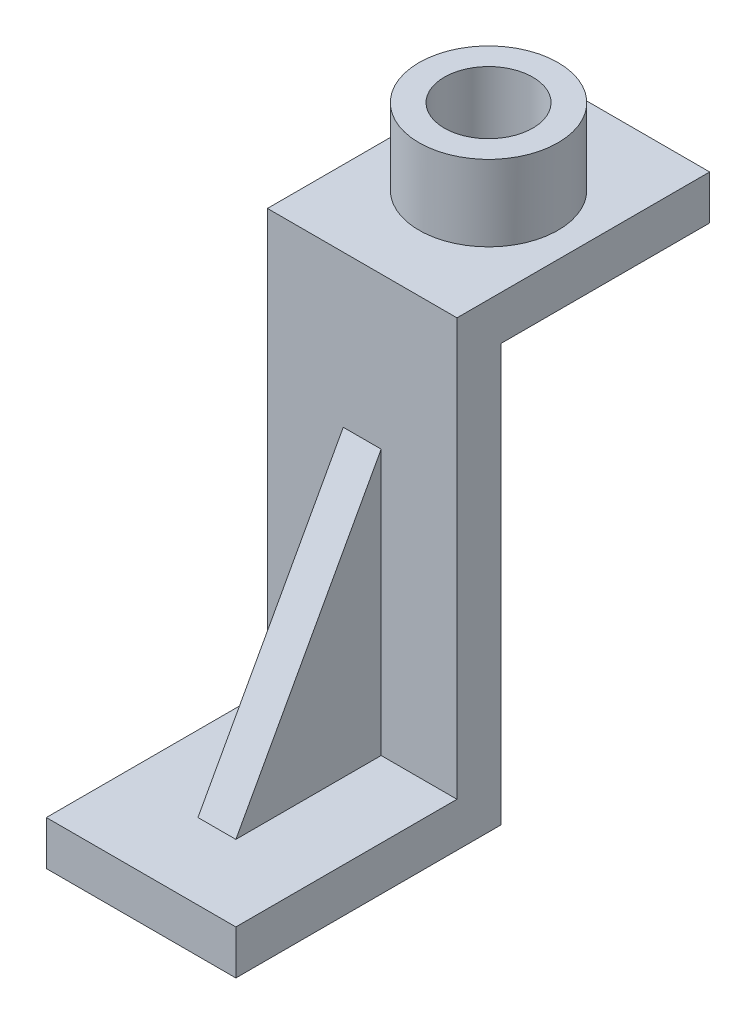
ISO-10303-21;
HEADER;
FILE_DESCRIPTION(('STEP AP214'),'2;1');
FILE_NAME('part.step','',(''),(''),'','','');
FILE_SCHEMA(('AUTOMOTIVE_DESIGN { 1 0 10303 214 1 1 1 1 }'));
ENDSEC;
DATA;
#1=APPLICATION_CONTEXT('core data for automotive mechanical design processes');
#2=APPLICATION_PROTOCOL_DEFINITION('international standard','automotive_design',2000,#1);
#3=PRODUCT_CONTEXT('',#1,'mechanical');
#4=PRODUCT('Part','Part','',(#3));
#5=PRODUCT_RELATED_PRODUCT_CATEGORY('part','',(#4));
#6=PRODUCT_DEFINITION_FORMATION('','',#4);
#7=PRODUCT_DEFINITION_CONTEXT('part definition',#1,'design');
#8=PRODUCT_DEFINITION('design','',#6,#7);
#9=PRODUCT_DEFINITION_SHAPE('','',#8);
#10=(LENGTH_UNIT() NAMED_UNIT(*) SI_UNIT(.MILLI.,.METRE.));
#11=(NAMED_UNIT(*) PLANE_ANGLE_UNIT() SI_UNIT($,.RADIAN.));
#12=(NAMED_UNIT(*) SI_UNIT($,.STERADIAN.) SOLID_ANGLE_UNIT());
#13=UNCERTAINTY_MEASURE_WITH_UNIT(LENGTH_MEASURE(1.E-05),#10,'distance_accuracy_value','');
#14=(GEOMETRIC_REPRESENTATION_CONTEXT(3) GLOBAL_UNCERTAINTY_ASSIGNED_CONTEXT((#13)) GLOBAL_UNIT_ASSIGNED_CONTEXT((#10,
#11,#12)) REPRESENTATION_CONTEXT('',''));
#15=CARTESIAN_POINT('',(0.,0.,0.));
#16=DIRECTION('',(0.,0.,1.));
#17=DIRECTION('',(1.,0.,0.));
#18=AXIS2_PLACEMENT_3D('',#15,#16,#17);
#19=CARTESIAN_POINT('',(0.,7.,-21.));
#20=DIRECTION('',(0.,-1.,0.));
#21=DIRECTION('',(0.,0.,-1.));
#22=AXIS2_PLACEMENT_3D('',#19,#20,#21);
#23=PLANE('',#22);
#24=DIRECTION('',(0.,0.,-1.));
#25=VECTOR('',#24,1.);
#26=CARTESIAN_POINT('',(18.,7.,9.));
#27=LINE('',#26,#25);
#28=CARTESIAN_POINT('',(18.,7.,9.));
#29=VERTEX_POINT('',#28);
#30=CARTESIAN_POINT('',(18.,7.,-14.));
#31=VERTEX_POINT('',#30);
#32=EDGE_CURVE('E126',#29,#31,#27,.T.);
#33=ORIENTED_EDGE('',*,*,#32,.F.);
#34=DIRECTION('',(-1.,0.,0.));
#35=VECTOR('',#34,1.);
#36=CARTESIAN_POINT('',(18.,7.,9.));
#37=LINE('',#36,#35);
#38=CARTESIAN_POINT('',(12.,7.,9.));
#39=VERTEX_POINT('',#38);
#40=EDGE_CURVE('E123',#29,#39,#37,.T.);
#41=ORIENTED_EDGE('',*,*,#40,.T.);
#42=DIRECTION('',(0.,0.,-1.));
#43=VECTOR('',#42,1.);
#44=CARTESIAN_POINT('',(12.,7.,9.));
#45=LINE('',#44,#43);
#46=CARTESIAN_POINT('',(12.,7.,-14.));
#47=VERTEX_POINT('',#46);
#48=EDGE_CURVE('E133',#39,#47,#45,.T.);
#49=ORIENTED_EDGE('',*,*,#48,.T.);
#50=DIRECTION('',(1.,0.,0.));
#51=VECTOR('',#50,1.);
#52=CARTESIAN_POINT('',(30.,7.,-14.));
#53=LINE('',#52,#51);
#54=CARTESIAN_POINT('',(0.,7.,-14.));
#55=VERTEX_POINT('',#54);
#56=EDGE_CURVE('E176',#55,#47,#53,.T.);
#57=ORIENTED_EDGE('',*,*,#56,.F.);
#58=DIRECTION('',(0.,0.,1.));
#59=VECTOR('',#58,1.);
#60=CARTESIAN_POINT('',(0.,7.,-21.));
#61=LINE('',#60,#59);
#62=CARTESIAN_POINT('',(0.,7.,21.));
#63=VERTEX_POINT('',#62);
#64=EDGE_CURVE('E190',#55,#63,#61,.T.);
#65=ORIENTED_EDGE('',*,*,#64,.T.);
#66=DIRECTION('',(1.,0.,0.));
#67=VECTOR('',#66,1.);
#68=CARTESIAN_POINT('',(0.,7.,21.));
#69=LINE('',#68,#67);
#70=CARTESIAN_POINT('',(30.,7.,21.));
#71=VERTEX_POINT('',#70);
#72=EDGE_CURVE('E186',#63,#71,#69,.T.);
#73=ORIENTED_EDGE('',*,*,#72,.T.);
#74=DIRECTION('',(0.,0.,1.));
#75=VECTOR('',#74,1.);
#76=CARTESIAN_POINT('',(30.,7.,-21.));
#77=LINE('',#76,#75);
#78=CARTESIAN_POINT('',(30.,7.,-14.));
#79=VERTEX_POINT('',#78);
#80=EDGE_CURVE('E189',#79,#71,#77,.T.);
#81=ORIENTED_EDGE('',*,*,#80,.F.);
#82=EDGE_CURVE('E171',#31,#79,#53,.T.);
#83=ORIENTED_EDGE('',*,*,#82,.F.);
#84=EDGE_LOOP('',(#33,#41,#49,#57,#65,#73,#81,#83));
#85=FACE_BOUND('',#84,.T.);
#86=ADVANCED_FACE('F37',(#85),#23,.F.);
#87=CARTESIAN_POINT('',(30.,73.,-14.));
#88=DIRECTION('',(0.,0.,-1.));
#89=DIRECTION('',(-1.,0.,0.));
#90=AXIS2_PLACEMENT_3D('',#87,#88,#89);
#91=PLANE('',#90);
#92=DIRECTION('',(0.,1.,0.));
#93=VECTOR('',#92,1.);
#94=CARTESIAN_POINT('',(18.,7.,-14.));
#95=LINE('',#94,#93);
#96=CARTESIAN_POINT('',(18.,49.,-14.));
#97=VERTEX_POINT('',#96);
#98=EDGE_CURVE('E127',#31,#97,#95,.T.);
#99=ORIENTED_EDGE('',*,*,#98,.F.);
#100=ORIENTED_EDGE('',*,*,#82,.T.);
#101=DIRECTION('',(0.,-1.,0.));
#102=VECTOR('',#101,1.);
#103=CARTESIAN_POINT('',(30.,73.,-14.));
#104=LINE('',#103,#102);
#105=CARTESIAN_POINT('',(30.,73.,-14.));
#106=VERTEX_POINT('',#105);
#107=EDGE_CURVE('E180',#106,#79,#104,.T.);
#108=ORIENTED_EDGE('',*,*,#107,.F.);
#109=DIRECTION('',(1.,0.,0.));
#110=VECTOR('',#109,1.);
#111=CARTESIAN_POINT('',(30.,73.,-14.));
#112=LINE('',#111,#110);
#113=CARTESIAN_POINT('',(0.,73.,-14.));
#114=VERTEX_POINT('',#113);
#115=EDGE_CURVE('E175',#114,#106,#112,.T.);
#116=ORIENTED_EDGE('',*,*,#115,.F.);
#117=DIRECTION('',(0.,-1.,0.));
#118=VECTOR('',#117,1.);
#119=CARTESIAN_POINT('',(0.,73.,-14.));
#120=LINE('',#119,#118);
#121=EDGE_CURVE('E184',#114,#55,#120,.T.);
#122=ORIENTED_EDGE('',*,*,#121,.T.);
#123=ORIENTED_EDGE('',*,*,#56,.T.);
#124=DIRECTION('',(0.,1.,0.));
#125=VECTOR('',#124,1.);
#126=CARTESIAN_POINT('',(12.,7.,-14.));
#127=LINE('',#126,#125);
#128=CARTESIAN_POINT('',(12.,49.,-14.));
#129=VERTEX_POINT('',#128);
#130=EDGE_CURVE('E138',#47,#129,#127,.T.);
#131=ORIENTED_EDGE('',*,*,#130,.T.);
#132=DIRECTION('',(-1.,0.,0.));
#133=VECTOR('',#132,1.);
#134=CARTESIAN_POINT('',(18.,49.,-14.));
#135=LINE('',#134,#133);
#136=EDGE_CURVE('E52',#97,#129,#135,.T.);
#137=ORIENTED_EDGE('',*,*,#136,.F.);
#138=EDGE_LOOP('',(#99,#100,#108,#116,#122,#123,#131,#137));
#139=FACE_BOUND('',#138,.T.);
#140=ADVANCED_FACE('F136',(#139),#91,.F.);
#141=CARTESIAN_POINT('',(0.,0.,21.));
#142=DIRECTION('',(1.,0.,0.));
#143=DIRECTION('',(0.,0.,-1.));
#144=AXIS2_PLACEMENT_3D('',#141,#142,#143);
#145=PLANE('',#144);
#146=ORIENTED_EDGE('',*,*,#64,.F.);
#147=ORIENTED_EDGE('',*,*,#121,.F.);
#148=DIRECTION('',(0.,0.,1.));
#149=VECTOR('',#148,1.);
#150=CARTESIAN_POINT('',(0.,73.,-14.));
#151=LINE('',#150,#149);
#152=CARTESIAN_POINT('',(0.,73.,-54.));
#153=VERTEX_POINT('',#152);
#154=EDGE_CURVE('E172',#153,#114,#151,.T.);
#155=ORIENTED_EDGE('',*,*,#154,.F.);
#156=DIRECTION('',(0.,-1.,0.));
#157=VECTOR('',#156,1.);
#158=CARTESIAN_POINT('',(0.,66.,-54.));
#159=LINE('',#158,#157);
#160=CARTESIAN_POINT('',(0.,66.,-54.));
#161=VERTEX_POINT('',#160);
#162=EDGE_CURVE('E152',#153,#161,#159,.T.);
#163=ORIENTED_EDGE('',*,*,#162,.T.);
#164=DIRECTION('',(0.,0.,1.));
#165=VECTOR('',#164,1.);
#166=CARTESIAN_POINT('',(0.,66.,-54.));
#167=LINE('',#166,#165);
#168=CARTESIAN_POINT('',(0.,66.,-21.));
#169=VERTEX_POINT('',#168);
#170=EDGE_CURVE('E164',#161,#169,#167,.T.);
#171=ORIENTED_EDGE('',*,*,#170,.T.);
#172=DIRECTION('',(0.,-1.,0.));
#173=VECTOR('',#172,1.);
#174=CARTESIAN_POINT('',(0.,0.,-21.));
#175=LINE('',#174,#173);
#176=CARTESIAN_POINT('',(0.,0.,-21.));
#177=VERTEX_POINT('',#176);
#178=EDGE_CURVE('E192',#169,#177,#175,.T.);
#179=ORIENTED_EDGE('',*,*,#178,.T.);
#180=DIRECTION('',(0.,0.,-1.));
#181=VECTOR('',#180,1.);
#182=CARTESIAN_POINT('',(0.,0.,21.));
#183=LINE('',#182,#181);
#184=CARTESIAN_POINT('',(0.,0.,21.));
#185=VERTEX_POINT('',#184);
#186=EDGE_CURVE('E45',#185,#177,#183,.T.);
#187=ORIENTED_EDGE('',*,*,#186,.F.);
#188=DIRECTION('',(0.,-1.,0.));
#189=VECTOR('',#188,1.);
#190=CARTESIAN_POINT('',(0.,0.,21.));
#191=LINE('',#190,#189);
#192=EDGE_CURVE('E194',#63,#185,#191,.T.);
#193=ORIENTED_EDGE('',*,*,#192,.F.);
#194=EDGE_LOOP('',(#146,#147,#155,#163,#171,#179,#187,#193));
#195=FACE_BOUND('',#194,.T.);
#196=ADVANCED_FACE('F39',(#195),#145,.F.);
#197=CARTESIAN_POINT('',(0.,0.,21.));
#198=DIRECTION('',(0.,1.,0.));
#199=DIRECTION('',(0.,0.,1.));
#200=AXIS2_PLACEMENT_3D('',#197,#198,#199);
#201=PLANE('',#200);
#202=DIRECTION('',(1.,0.,0.));
#203=VECTOR('',#202,1.);
#204=CARTESIAN_POINT('',(0.,0.,-21.));
#205=LINE('',#204,#203);
#206=CARTESIAN_POINT('',(30.,0.,-21.));
#207=VERTEX_POINT('',#206);
#208=EDGE_CURVE('E204',#177,#207,#205,.T.);
#209=ORIENTED_EDGE('',*,*,#208,.T.);
#210=DIRECTION('',(0.,0.,-1.));
#211=VECTOR('',#210,1.);
#212=CARTESIAN_POINT('',(30.,0.,21.));
#213=LINE('',#212,#211);
#214=CARTESIAN_POINT('',(30.,0.,21.));
#215=VERTEX_POINT('',#214);
#216=EDGE_CURVE('E202',#215,#207,#213,.T.);
#217=ORIENTED_EDGE('',*,*,#216,.F.);
#218=DIRECTION('',(1.,0.,0.));
#219=VECTOR('',#218,1.);
#220=CARTESIAN_POINT('',(0.,0.,21.));
#221=LINE('',#220,#219);
#222=EDGE_CURVE('E196',#185,#215,#221,.T.);
#223=ORIENTED_EDGE('',*,*,#222,.F.);
#224=ORIENTED_EDGE('',*,*,#186,.T.);
#225=EDGE_LOOP('',(#209,#217,#223,#224));
#226=FACE_BOUND('',#225,.T.);
#227=ADVANCED_FACE('F212',(#226),#201,.F.);
#228=CARTESIAN_POINT('',(30.,0.,21.));
#229=DIRECTION('',(-1.,0.,0.));
#230=DIRECTION('',(0.,0.,1.));
#231=AXIS2_PLACEMENT_3D('',#228,#229,#230);
#232=PLANE('',#231);
#233=DIRECTION('',(0.,1.,0.));
#234=VECTOR('',#233,1.);
#235=CARTESIAN_POINT('',(30.,0.,-21.));
#236=LINE('',#235,#234);
#237=CARTESIAN_POINT('',(30.,66.,-21.));
#238=VERTEX_POINT('',#237);
#239=EDGE_CURVE('E197',#207,#238,#236,.T.);
#240=ORIENTED_EDGE('',*,*,#239,.T.);
#241=DIRECTION('',(0.,0.,1.));
#242=VECTOR('',#241,1.);
#243=CARTESIAN_POINT('',(30.,66.,-54.));
#244=LINE('',#243,#242);
#245=CARTESIAN_POINT('',(30.,66.,-54.));
#246=VERTEX_POINT('',#245);
#247=EDGE_CURVE('E165',#246,#238,#244,.T.);
#248=ORIENTED_EDGE('',*,*,#247,.F.);
#249=DIRECTION('',(0.,1.,0.));
#250=VECTOR('',#249,1.);
#251=CARTESIAN_POINT('',(30.,73.,-54.));
#252=LINE('',#251,#250);
#253=CARTESIAN_POINT('',(30.,73.,-54.));
#254=VERTEX_POINT('',#253);
#255=EDGE_CURVE('E158',#246,#254,#252,.T.);
#256=ORIENTED_EDGE('',*,*,#255,.T.);
#257=DIRECTION('',(0.,0.,-1.));
#258=VECTOR('',#257,1.);
#259=CARTESIAN_POINT('',(30.,73.,-21.));
#260=LINE('',#259,#258);
#261=EDGE_CURVE('E178',#106,#254,#260,.T.);
#262=ORIENTED_EDGE('',*,*,#261,.F.);
#263=ORIENTED_EDGE('',*,*,#107,.T.);
#264=ORIENTED_EDGE('',*,*,#80,.T.);
#265=DIRECTION('',(0.,1.,0.));
#266=VECTOR('',#265,1.);
#267=CARTESIAN_POINT('',(30.,0.,21.));
#268=LINE('',#267,#266);
#269=EDGE_CURVE('E199',#215,#71,#268,.T.);
#270=ORIENTED_EDGE('',*,*,#269,.F.);
#271=ORIENTED_EDGE('',*,*,#216,.T.);
#272=EDGE_LOOP('',(#240,#248,#256,#262,#263,#264,#270,#271));
#273=FACE_BOUND('',#272,.T.);
#274=ADVANCED_FACE('F220',(#273),#232,.F.);
#275=CARTESIAN_POINT('',(0.,0.,21.));
#276=DIRECTION('',(0.,0.,-1.));
#277=DIRECTION('',(-1.,0.,0.));
#278=AXIS2_PLACEMENT_3D('',#275,#276,#277);
#279=PLANE('',#278);
#280=ORIENTED_EDGE('',*,*,#269,.T.);
#281=ORIENTED_EDGE('',*,*,#72,.F.);
#282=ORIENTED_EDGE('',*,*,#192,.T.);
#283=ORIENTED_EDGE('',*,*,#222,.T.);
#284=EDGE_LOOP('',(#280,#281,#282,#283));
#285=FACE_BOUND('',#284,.T.);
#286=ADVANCED_FACE('F240',(#285),#279,.F.);
#287=CARTESIAN_POINT('',(0.,0.,-21.));
#288=DIRECTION('',(0.,0.,-1.));
#289=DIRECTION('',(-1.,0.,0.));
#290=AXIS2_PLACEMENT_3D('',#287,#288,#289);
#291=PLANE('',#290);
#292=DIRECTION('',(-1.,0.,0.));
#293=VECTOR('',#292,1.);
#294=CARTESIAN_POINT('',(0.,66.,-21.));
#295=LINE('',#294,#293);
#296=EDGE_CURVE('E60',#238,#169,#295,.T.);
#297=ORIENTED_EDGE('',*,*,#296,.F.);
#298=ORIENTED_EDGE('',*,*,#239,.F.);
#299=ORIENTED_EDGE('',*,*,#208,.F.);
#300=ORIENTED_EDGE('',*,*,#178,.F.);
#301=EDGE_LOOP('',(#297,#298,#299,#300));
#302=FACE_BOUND('',#301,.T.);
#303=ADVANCED_FACE('F218',(#302),#291,.T.);
#304=CARTESIAN_POINT('',(0.,73.,0.));
#305=DIRECTION('',(0.,-1.,0.));
#306=DIRECTION('',(0.,0.,-1.));
#307=AXIS2_PLACEMENT_3D('',#304,#305,#306);
#308=PLANE('',#307);
#309=CARTESIAN_POINT('',(15.,73.,-34.));
#310=DIRECTION('',(0.,-1.,0.));
#311=DIRECTION('',(0.,0.,-1.));
#312=AXIS2_PLACEMENT_3D('',#309,#310,#311);
#313=CIRCLE('',#312,11.);
#314=CARTESIAN_POINT('',(15.,73.,-45.));
#315=VERTEX_POINT('',#314);
#316=EDGE_CURVE('E11',#315,#315,#313,.F.);
#317=ORIENTED_EDGE('',*,*,#316,.F.);
#318=EDGE_LOOP('',(#317));
#319=FACE_BOUND('',#318,.T.);
#320=ORIENTED_EDGE('',*,*,#154,.T.);
#321=ORIENTED_EDGE('',*,*,#115,.T.);
#322=ORIENTED_EDGE('',*,*,#261,.T.);
#323=DIRECTION('',(-1.,0.,0.));
#324=VECTOR('',#323,1.);
#325=CARTESIAN_POINT('',(0.,73.,-54.));
#326=LINE('',#325,#324);
#327=EDGE_CURVE('E161',#254,#153,#326,.T.);
#328=ORIENTED_EDGE('',*,*,#327,.T.);
#329=EDGE_LOOP('',(#320,#321,#322,#328));
#330=FACE_BOUND('',#329,.T.);
#331=ADVANCED_FACE('F232',(#319,#330),#308,.F.);
#332=CARTESIAN_POINT('',(30.,66.,-54.));
#333=DIRECTION('',(0.,-1.,0.));
#334=DIRECTION('',(0.,0.,-1.));
#335=AXIS2_PLACEMENT_3D('',#332,#333,#334);
#336=PLANE('',#335);
#337=ORIENTED_EDGE('',*,*,#247,.T.);
#338=ORIENTED_EDGE('',*,*,#296,.T.);
#339=ORIENTED_EDGE('',*,*,#170,.F.);
#340=DIRECTION('',(1.,0.,0.));
#341=VECTOR('',#340,1.);
#342=CARTESIAN_POINT('',(30.,66.,-54.));
#343=LINE('',#342,#341);
#344=EDGE_CURVE('E155',#161,#246,#343,.T.);
#345=ORIENTED_EDGE('',*,*,#344,.T.);
#346=EDGE_LOOP('',(#337,#338,#339,#345));
#347=FACE_BOUND('',#346,.T.);
#348=ADVANCED_FACE('F224',(#347),#336,.T.);
#349=CARTESIAN_POINT('',(0.,0.,-54.));
#350=DIRECTION('',(0.,0.,-1.));
#351=DIRECTION('',(-1.,0.,0.));
#352=AXIS2_PLACEMENT_3D('',#349,#350,#351);
#353=PLANE('',#352);
#354=ORIENTED_EDGE('',*,*,#162,.F.);
#355=ORIENTED_EDGE('',*,*,#327,.F.);
#356=ORIENTED_EDGE('',*,*,#255,.F.);
#357=ORIENTED_EDGE('',*,*,#344,.F.);
#358=EDGE_LOOP('',(#354,#355,#356,#357));
#359=FACE_BOUND('',#358,.T.);
#360=ADVANCED_FACE('F228',(#359),#353,.T.);
#361=CARTESIAN_POINT('',(15.,85.,-34.));
#362=DIRECTION('',(0.,1.,0.));
#363=DIRECTION('',(0.,0.,1.));
#364=AXIS2_PLACEMENT_3D('',#361,#362,#363);
#365=PLANE('',#364);
#366=CARTESIAN_POINT('',(15.,85.,-34.));
#367=DIRECTION('',(0.,1.,0.));
#368=DIRECTION('',(0.,0.,1.));
#369=AXIS2_PLACEMENT_3D('',#366,#367,#368);
#370=CIRCLE('',#369,11.);
#371=CARTESIAN_POINT('',(15.,85.,-23.));
#372=VERTEX_POINT('',#371);
#373=EDGE_CURVE('E148',#372,#372,#370,.T.);
#374=ORIENTED_EDGE('',*,*,#373,.T.);
#375=EDGE_LOOP('',(#374));
#376=FACE_BOUND('',#375,.T.);
#377=CARTESIAN_POINT('',(15.,85.,-34.));
#378=DIRECTION('',(0.,1.,0.));
#379=DIRECTION('',(0.,0.,1.));
#380=AXIS2_PLACEMENT_3D('',#377,#378,#379);
#381=CIRCLE('',#380,7.);
#382=CARTESIAN_POINT('',(15.,85.,-27.));
#383=VERTEX_POINT('',#382);
#384=EDGE_CURVE('E142',#383,#383,#381,.T.);
#385=ORIENTED_EDGE('',*,*,#384,.F.);
#386=EDGE_LOOP('',(#385));
#387=FACE_BOUND('',#386,.T.);
#388=ADVANCED_FACE('F264',(#376,#387),#365,.T.);
#389=CARTESIAN_POINT('',(15.,85.,-34.));
#390=DIRECTION('',(0.,-1.,0.));
#391=DIRECTION('',(0.,0.,-1.));
#392=AXIS2_PLACEMENT_3D('',#389,#390,#391);
#393=CYLINDRICAL_SURFACE('',#392,11.);
#394=ORIENTED_EDGE('',*,*,#373,.F.);
#395=EDGE_LOOP('',(#394));
#396=FACE_BOUND('',#395,.T.);
#397=ORIENTED_EDGE('',*,*,#316,.T.);
#398=EDGE_LOOP('',(#397));
#399=FACE_BOUND('',#398,.T.);
#400=ADVANCED_FACE('F265',(#396,#399),#393,.T.);
#401=CARTESIAN_POINT('',(15.,85.,-34.));
#402=DIRECTION('',(0.,-1.,0.));
#403=DIRECTION('',(0.,0.,-1.));
#404=AXIS2_PLACEMENT_3D('',#401,#402,#403);
#405=CYLINDRICAL_SURFACE('',#404,7.);
#406=ORIENTED_EDGE('',*,*,#384,.T.);
#407=EDGE_LOOP('',(#406));
#408=FACE_BOUND('',#407,.T.);
#409=CARTESIAN_POINT('',(15.,73.,-34.));
#410=DIRECTION('',(0.,1.,0.));
#411=DIRECTION('',(0.,0.,1.));
#412=AXIS2_PLACEMENT_3D('',#409,#410,#411);
#413=CIRCLE('',#412,7.);
#414=CARTESIAN_POINT('',(15.,73.,-27.));
#415=VERTEX_POINT('',#414);
#416=EDGE_CURVE('E139',#415,#415,#413,.T.);
#417=ORIENTED_EDGE('',*,*,#416,.F.);
#418=EDGE_LOOP('',(#417));
#419=FACE_BOUND('',#418,.T.);
#420=ADVANCED_FACE('F268',(#408,#419),#405,.F.);
#421=ORIENTED_EDGE('',*,*,#416,.T.);
#422=EDGE_LOOP('',(#421));
#423=FACE_BOUND('',#422,.T.);
#424=ADVANCED_FACE('F259',(#423),#308,.F.);
#425=CARTESIAN_POINT('',(18.,49.,-14.));
#426=DIRECTION('',(0.,-0.480314622865584,-0.877096267841502));
#427=DIRECTION('',(0.,0.877096267841502,-0.480314622865584));
#428=AXIS2_PLACEMENT_3D('',#425,#426,#427);
#429=PLANE('',#428);
#430=DIRECTION('',(0.,-0.877096267841502,0.480314622865584));
#431=VECTOR('',#430,1.);
#432=CARTESIAN_POINT('',(12.,49.,-14.));
#433=LINE('',#432,#431);
#434=EDGE_CURVE('E444',#129,#39,#433,.T.);
#435=ORIENTED_EDGE('',*,*,#434,.T.);
#436=ORIENTED_EDGE('',*,*,#40,.F.);
#437=DIRECTION('',(0.,-0.877096267841502,0.480314622865584));
#438=VECTOR('',#437,1.);
#439=CARTESIAN_POINT('',(18.,49.,-14.));
#440=LINE('',#439,#438);
#441=EDGE_CURVE('E119',#97,#29,#440,.T.);
#442=ORIENTED_EDGE('',*,*,#441,.F.);
#443=ORIENTED_EDGE('',*,*,#136,.T.);
#444=EDGE_LOOP('',(#435,#436,#442,#443));
#445=FACE_BOUND('',#444,.T.);
#446=ADVANCED_FACE('F121',(#445),#429,.F.);
#447=CARTESIAN_POINT('',(18.,0.,0.));
#448=DIRECTION('',(-1.,0.,0.));
#449=DIRECTION('',(0.,0.,1.));
#450=AXIS2_PLACEMENT_3D('',#447,#448,#449);
#451=PLANE('',#450);
#452=ORIENTED_EDGE('',*,*,#98,.T.);
#453=ORIENTED_EDGE('',*,*,#441,.T.);
#454=ORIENTED_EDGE('',*,*,#32,.T.);
#455=EDGE_LOOP('',(#452,#453,#454));
#456=FACE_BOUND('',#455,.T.);
#457=ADVANCED_FACE('F130',(#456),#451,.F.);
#458=CARTESIAN_POINT('',(12.,0.,0.));
#459=DIRECTION('',(-1.,0.,0.));
#460=DIRECTION('',(0.,0.,1.));
#461=AXIS2_PLACEMENT_3D('',#458,#459,#460);
#462=PLANE('',#461);
#463=ORIENTED_EDGE('',*,*,#130,.F.);
#464=ORIENTED_EDGE('',*,*,#48,.F.);
#465=ORIENTED_EDGE('',*,*,#434,.F.);
#466=EDGE_LOOP('',(#463,#464,#465));
#467=FACE_BOUND('',#466,.T.);
#468=ADVANCED_FACE('F278',(#467),#462,.T.);
#469=CLOSED_SHELL('',(#86,#140,#196,#227,#274,#286,#303,#331,#348,#360,#388,#400,#420,#424,#446,
#457,#468));
#470=MANIFOLD_SOLID_BREP('B2',#469);
#471=ADVANCED_BREP_SHAPE_REPRESENTATION('',(#18,#470),#14);
#472=SHAPE_DEFINITION_REPRESENTATION(#9,#471);
ENDSEC;
END-ISO-10303-21;
